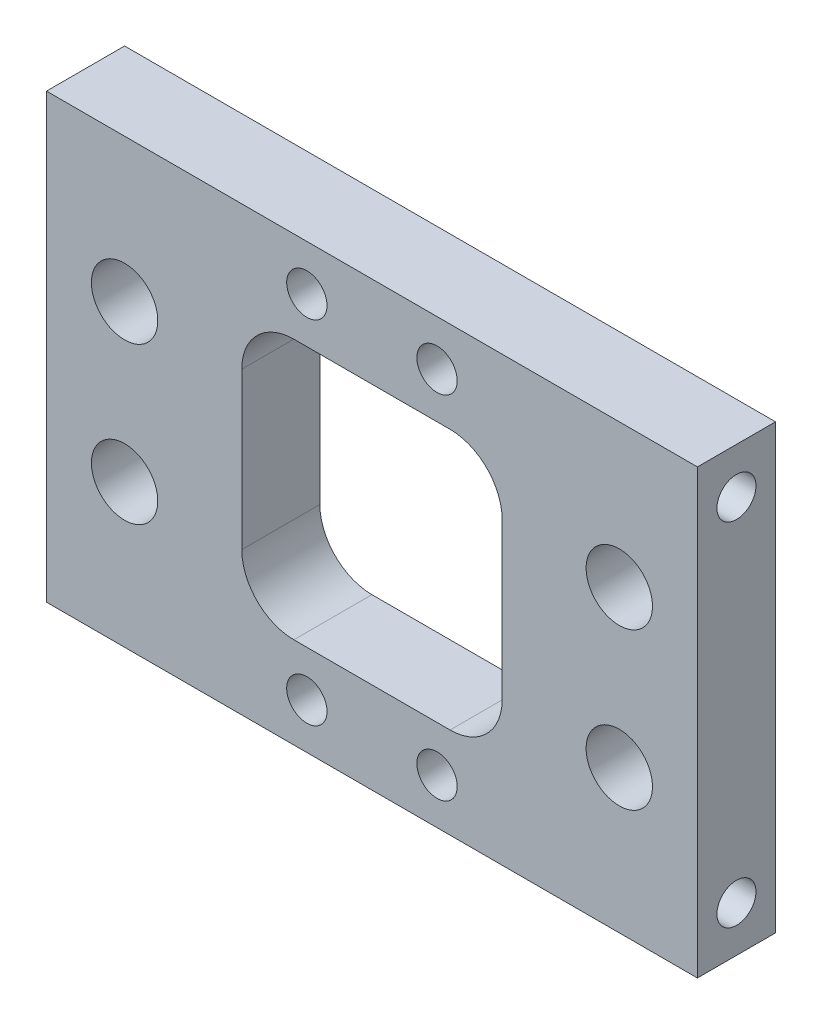
ISO-10303-21;
HEADER;
FILE_DESCRIPTION(('STEP AP214'),'2;1');
FILE_NAME('part.step','',(''),(''),'','','');
FILE_SCHEMA(('AUTOMOTIVE_DESIGN { 1 0 10303 214 1 1 1 1 }'));
ENDSEC;
DATA;
#1=APPLICATION_CONTEXT('core data for automotive mechanical design processes');
#2=APPLICATION_PROTOCOL_DEFINITION('international standard','automotive_design',2000,#1);
#3=PRODUCT_CONTEXT('',#1,'mechanical');
#4=PRODUCT('Part','Part','',(#3));
#5=PRODUCT_RELATED_PRODUCT_CATEGORY('part','',(#4));
#6=PRODUCT_DEFINITION_FORMATION('','',#4);
#7=PRODUCT_DEFINITION_CONTEXT('part definition',#1,'design');
#8=PRODUCT_DEFINITION('design','',#6,#7);
#9=PRODUCT_DEFINITION_SHAPE('','',#8);
#10=(LENGTH_UNIT() NAMED_UNIT(*) SI_UNIT(.MILLI.,.METRE.));
#11=(NAMED_UNIT(*) PLANE_ANGLE_UNIT() SI_UNIT($,.RADIAN.));
#12=(NAMED_UNIT(*) SI_UNIT($,.STERADIAN.) SOLID_ANGLE_UNIT());
#13=UNCERTAINTY_MEASURE_WITH_UNIT(LENGTH_MEASURE(1.E-05),#10,'distance_accuracy_value','');
#14=(GEOMETRIC_REPRESENTATION_CONTEXT(3) GLOBAL_UNCERTAINTY_ASSIGNED_CONTEXT((#13)) GLOBAL_UNIT_ASSIGNED_CONTEXT((#10,
#11,#12)) REPRESENTATION_CONTEXT('',''));
#15=CARTESIAN_POINT('',(0.,0.,0.));
#16=DIRECTION('',(0.,0.,1.));
#17=DIRECTION('',(1.,0.,0.));
#18=AXIS2_PLACEMENT_3D('',#15,#16,#17);
#19=CARTESIAN_POINT('',(25.,17.,3.));
#20=DIRECTION('',(1.,0.,0.));
#21=DIRECTION('',(0.,0.,-1.));
#22=AXIS2_PLACEMENT_3D('',#19,#20,#21);
#23=PLANE('',#22);
#24=CARTESIAN_POINT('',(25.,-13.5,0.));
#25=DIRECTION('',(1.,0.,0.));
#26=DIRECTION('',(0.,0.,-1.));
#27=AXIS2_PLACEMENT_3D('',#24,#25,#26);
#28=CIRCLE('',#27,1.49999999999999);
#29=CARTESIAN_POINT('',(25.,-13.5,-1.49999999999999));
#30=VERTEX_POINT('',#29);
#31=EDGE_CURVE('E278',#30,#30,#28,.T.);
#32=ORIENTED_EDGE('',*,*,#31,.F.);
#33=EDGE_LOOP('',(#32));
#34=FACE_BOUND('',#33,.T.);
#35=CARTESIAN_POINT('',(25.,13.5,0.));
#36=DIRECTION('',(1.,0.,0.));
#37=DIRECTION('',(0.,0.,-1.));
#38=AXIS2_PLACEMENT_3D('',#35,#36,#37);
#39=CIRCLE('',#38,1.49999999999999);
#40=CARTESIAN_POINT('',(25.,13.5,-1.49999999999999));
#41=VERTEX_POINT('',#40);
#42=EDGE_CURVE('E272',#41,#41,#39,.T.);
#43=ORIENTED_EDGE('',*,*,#42,.F.);
#44=EDGE_LOOP('',(#43));
#45=FACE_BOUND('',#44,.T.);
#46=DIRECTION('',(0.,-1.,0.));
#47=VECTOR('',#46,1.);
#48=CARTESIAN_POINT('',(25.,17.,-3.));
#49=LINE('',#48,#47);
#50=CARTESIAN_POINT('',(25.,17.,-3.));
#51=VERTEX_POINT('',#50);
#52=CARTESIAN_POINT('',(25.,-17.,-3.));
#53=VERTEX_POINT('',#52);
#54=EDGE_CURVE('E158',#51,#53,#49,.T.);
#55=ORIENTED_EDGE('',*,*,#54,.F.);
#56=DIRECTION('',(0.,0.,-1.));
#57=VECTOR('',#56,1.);
#58=CARTESIAN_POINT('',(25.,17.,3.));
#59=LINE('',#58,#57);
#60=CARTESIAN_POINT('',(25.,17.,3.));
#61=VERTEX_POINT('',#60);
#62=EDGE_CURVE('E146',#61,#51,#59,.T.);
#63=ORIENTED_EDGE('',*,*,#62,.F.);
#64=DIRECTION('',(0.,-1.,0.));
#65=VECTOR('',#64,1.);
#66=CARTESIAN_POINT('',(25.,17.,3.));
#67=LINE('',#66,#65);
#68=CARTESIAN_POINT('',(25.,-17.,3.));
#69=VERTEX_POINT('',#68);
#70=EDGE_CURVE('E141',#61,#69,#67,.T.);
#71=ORIENTED_EDGE('',*,*,#70,.T.);
#72=DIRECTION('',(0.,0.,-1.));
#73=VECTOR('',#72,1.);
#74=CARTESIAN_POINT('',(25.,-17.,3.));
#75=LINE('',#74,#73);
#76=EDGE_CURVE('E123',#69,#53,#75,.T.);
#77=ORIENTED_EDGE('',*,*,#76,.T.);
#78=EDGE_LOOP('',(#55,#63,#71,#77));
#79=FACE_BOUND('',#78,.T.);
#80=ADVANCED_FACE('F34',(#34,#45,#79),#23,.T.);
#81=CARTESIAN_POINT('',(-25.,17.,3.));
#82=DIRECTION('',(0.,1.,0.));
#83=DIRECTION('',(0.,0.,1.));
#84=AXIS2_PLACEMENT_3D('',#81,#82,#83);
#85=PLANE('',#84);
#86=DIRECTION('',(1.,0.,0.));
#87=VECTOR('',#86,1.);
#88=CARTESIAN_POINT('',(-25.,17.,-3.));
#89=LINE('',#88,#87);
#90=CARTESIAN_POINT('',(-25.,17.,-3.));
#91=VERTEX_POINT('',#90);
#92=EDGE_CURVE('E147',#91,#51,#89,.T.);
#93=ORIENTED_EDGE('',*,*,#92,.F.);
#94=DIRECTION('',(0.,0.,-1.));
#95=VECTOR('',#94,1.);
#96=CARTESIAN_POINT('',(-25.,17.,3.));
#97=LINE('',#96,#95);
#98=CARTESIAN_POINT('',(-25.,17.,3.));
#99=VERTEX_POINT('',#98);
#100=EDGE_CURVE('E166',#99,#91,#97,.T.);
#101=ORIENTED_EDGE('',*,*,#100,.F.);
#102=DIRECTION('',(1.,0.,0.));
#103=VECTOR('',#102,1.);
#104=CARTESIAN_POINT('',(-25.,17.,3.));
#105=LINE('',#104,#103);
#106=EDGE_CURVE('E134',#99,#61,#105,.T.);
#107=ORIENTED_EDGE('',*,*,#106,.T.);
#108=ORIENTED_EDGE('',*,*,#62,.T.);
#109=EDGE_LOOP('',(#93,#101,#107,#108));
#110=FACE_BOUND('',#109,.T.);
#111=ADVANCED_FACE('F320',(#110),#85,.T.);
#112=CARTESIAN_POINT('',(-25.,-17.,3.));
#113=DIRECTION('',(-1.,0.,0.));
#114=DIRECTION('',(0.,-1.,0.));
#115=AXIS2_PLACEMENT_3D('',#112,#113,#114);
#116=PLANE('',#115);
#117=CARTESIAN_POINT('',(-25.,-13.5,0.));
#118=DIRECTION('',(-1.,0.,0.));
#119=DIRECTION('',(0.,0.,1.));
#120=AXIS2_PLACEMENT_3D('',#117,#118,#119);
#121=CIRCLE('',#120,1.49999999999999);
#122=CARTESIAN_POINT('',(-25.,-13.5,1.49999999999999));
#123=VERTEX_POINT('',#122);
#124=EDGE_CURVE('E266',#123,#123,#121,.T.);
#125=ORIENTED_EDGE('',*,*,#124,.F.);
#126=EDGE_LOOP('',(#125));
#127=FACE_BOUND('',#126,.T.);
#128=CARTESIAN_POINT('',(-25.,13.5,0.));
#129=DIRECTION('',(-1.,0.,0.));
#130=DIRECTION('',(0.,0.,1.));
#131=AXIS2_PLACEMENT_3D('',#128,#129,#130);
#132=CIRCLE('',#131,1.49999999999999);
#133=CARTESIAN_POINT('',(-25.,13.5,1.49999999999999));
#134=VERTEX_POINT('',#133);
#135=EDGE_CURVE('E260',#134,#134,#132,.T.);
#136=ORIENTED_EDGE('',*,*,#135,.F.);
#137=EDGE_LOOP('',(#136));
#138=FACE_BOUND('',#137,.T.);
#139=DIRECTION('',(0.,1.,0.));
#140=VECTOR('',#139,1.);
#141=CARTESIAN_POINT('',(-25.,-17.,-3.));
#142=LINE('',#141,#140);
#143=CARTESIAN_POINT('',(-25.,-17.,-3.));
#144=VERTEX_POINT('',#143);
#145=EDGE_CURVE('E150',#144,#91,#142,.T.);
#146=ORIENTED_EDGE('',*,*,#145,.F.);
#147=DIRECTION('',(0.,0.,-1.));
#148=VECTOR('',#147,1.);
#149=CARTESIAN_POINT('',(-25.,-17.,3.));
#150=LINE('',#149,#148);
#151=CARTESIAN_POINT('',(-25.,-17.,3.));
#152=VERTEX_POINT('',#151);
#153=EDGE_CURVE('E133',#152,#144,#150,.T.);
#154=ORIENTED_EDGE('',*,*,#153,.F.);
#155=DIRECTION('',(0.,1.,0.));
#156=VECTOR('',#155,1.);
#157=CARTESIAN_POINT('',(-25.,-17.,3.));
#158=LINE('',#157,#156);
#159=EDGE_CURVE('E144',#152,#99,#158,.T.);
#160=ORIENTED_EDGE('',*,*,#159,.T.);
#161=ORIENTED_EDGE('',*,*,#100,.T.);
#162=EDGE_LOOP('',(#146,#154,#160,#161));
#163=FACE_BOUND('',#162,.T.);
#164=ADVANCED_FACE('F326',(#127,#138,#163),#116,.T.);
#165=CARTESIAN_POINT('',(25.,-17.,3.));
#166=DIRECTION('',(0.,-1.,0.));
#167=DIRECTION('',(0.,0.,-1.));
#168=AXIS2_PLACEMENT_3D('',#165,#166,#167);
#169=PLANE('',#168);
#170=DIRECTION('',(-1.,0.,0.));
#171=VECTOR('',#170,1.);
#172=CARTESIAN_POINT('',(25.,-17.,-3.));
#173=LINE('',#172,#171);
#174=EDGE_CURVE('E128',#53,#144,#173,.T.);
#175=ORIENTED_EDGE('',*,*,#174,.F.);
#176=ORIENTED_EDGE('',*,*,#76,.F.);
#177=DIRECTION('',(-1.,0.,0.));
#178=VECTOR('',#177,1.);
#179=CARTESIAN_POINT('',(25.,-17.,3.));
#180=LINE('',#179,#178);
#181=EDGE_CURVE('E126',#69,#152,#180,.T.);
#182=ORIENTED_EDGE('',*,*,#181,.T.);
#183=ORIENTED_EDGE('',*,*,#153,.T.);
#184=EDGE_LOOP('',(#175,#176,#182,#183));
#185=FACE_BOUND('',#184,.T.);
#186=ADVANCED_FACE('F125',(#185),#169,.T.);
#187=CARTESIAN_POINT('',(0.,0.,3.));
#188=DIRECTION('',(0.,0.,-1.));
#189=DIRECTION('',(-1.,0.,0.));
#190=AXIS2_PLACEMENT_3D('',#187,#188,#189);
#191=PLANE('',#190);
#192=CARTESIAN_POINT('',(5.,13.5,3.));
#193=DIRECTION('',(0.,0.,-1.));
#194=DIRECTION('',(1.,0.,0.));
#195=AXIS2_PLACEMENT_3D('',#192,#193,#194);
#196=CIRCLE('',#195,1.55);
#197=CARTESIAN_POINT('',(6.55,13.5,3.));
#198=VERTEX_POINT('',#197);
#199=EDGE_CURVE('E297',#198,#198,#196,.T.);
#200=ORIENTED_EDGE('',*,*,#199,.T.);
#201=EDGE_LOOP('',(#200));
#202=FACE_BOUND('',#201,.T.);
#203=CARTESIAN_POINT('',(-5.,13.5,3.));
#204=DIRECTION('',(0.,0.,-1.));
#205=DIRECTION('',(1.,0.,0.));
#206=AXIS2_PLACEMENT_3D('',#203,#204,#205);
#207=CIRCLE('',#206,1.55);
#208=CARTESIAN_POINT('',(-3.45,13.5,3.));
#209=VERTEX_POINT('',#208);
#210=EDGE_CURVE('E298',#209,#209,#207,.T.);
#211=ORIENTED_EDGE('',*,*,#210,.T.);
#212=EDGE_LOOP('',(#211));
#213=FACE_BOUND('',#212,.T.);
#214=CARTESIAN_POINT('',(5.,-13.5,3.));
#215=DIRECTION('',(0.,0.,1.));
#216=DIRECTION('',(1.,0.,0.));
#217=AXIS2_PLACEMENT_3D('',#214,#215,#216);
#218=CIRCLE('',#217,1.55);
#219=CARTESIAN_POINT('',(6.55,-13.5,3.));
#220=VERTEX_POINT('',#219);
#221=EDGE_CURVE('E281',#220,#220,#218,.T.);
#222=ORIENTED_EDGE('',*,*,#221,.F.);
#223=EDGE_LOOP('',(#222));
#224=FACE_BOUND('',#223,.T.);
#225=CARTESIAN_POINT('',(-5.,-13.5,3.));
#226=DIRECTION('',(0.,0.,1.));
#227=DIRECTION('',(1.,0.,0.));
#228=AXIS2_PLACEMENT_3D('',#225,#226,#227);
#229=CIRCLE('',#228,1.55);
#230=CARTESIAN_POINT('',(-3.45,-13.5,3.));
#231=VERTEX_POINT('',#230);
#232=EDGE_CURVE('E285',#231,#231,#229,.T.);
#233=ORIENTED_EDGE('',*,*,#232,.F.);
#234=EDGE_LOOP('',(#233));
#235=FACE_BOUND('',#234,.T.);
#236=CARTESIAN_POINT('',(19.,6.00000000000001,3.));
#237=DIRECTION('',(0.,0.,-1.));
#238=DIRECTION('',(-1.,0.,0.));
#239=AXIS2_PLACEMENT_3D('',#236,#237,#238);
#240=CIRCLE('',#239,2.55);
#241=CARTESIAN_POINT('',(16.45,6.00000000000001,3.));
#242=VERTEX_POINT('',#241);
#243=EDGE_CURVE('E251',#242,#242,#240,.T.);
#244=ORIENTED_EDGE('',*,*,#243,.T.);
#245=EDGE_LOOP('',(#244));
#246=FACE_BOUND('',#245,.T.);
#247=CARTESIAN_POINT('',(-19.,-6.00000000000001,3.));
#248=DIRECTION('',(0.,0.,-1.));
#249=DIRECTION('',(-1.,0.,0.));
#250=AXIS2_PLACEMENT_3D('',#247,#248,#249);
#251=CIRCLE('',#250,2.55);
#252=CARTESIAN_POINT('',(-21.55,-6.00000000000001,3.));
#253=VERTEX_POINT('',#252);
#254=EDGE_CURVE('E245',#253,#253,#251,.T.);
#255=ORIENTED_EDGE('',*,*,#254,.T.);
#256=EDGE_LOOP('',(#255));
#257=FACE_BOUND('',#256,.T.);
#258=CARTESIAN_POINT('',(19.,-6.00000000000001,3.));
#259=DIRECTION('',(0.,0.,-1.));
#260=DIRECTION('',(-1.,0.,0.));
#261=AXIS2_PLACEMENT_3D('',#258,#259,#260);
#262=CIRCLE('',#261,2.55);
#263=CARTESIAN_POINT('',(16.45,-6.00000000000001,3.));
#264=VERTEX_POINT('',#263);
#265=EDGE_CURVE('E239',#264,#264,#262,.T.);
#266=ORIENTED_EDGE('',*,*,#265,.T.);
#267=EDGE_LOOP('',(#266));
#268=FACE_BOUND('',#267,.T.);
#269=CARTESIAN_POINT('',(-19.,6.00000000000001,3.));
#270=DIRECTION('',(0.,0.,-1.));
#271=DIRECTION('',(-1.,0.,0.));
#272=AXIS2_PLACEMENT_3D('',#269,#270,#271);
#273=CIRCLE('',#272,2.55);
#274=CARTESIAN_POINT('',(-21.55,6.00000000000001,3.));
#275=VERTEX_POINT('',#274);
#276=EDGE_CURVE('E225',#275,#275,#273,.T.);
#277=ORIENTED_EDGE('',*,*,#276,.T.);
#278=EDGE_LOOP('',(#277));
#279=FACE_BOUND('',#278,.T.);
#280=DIRECTION('',(-1.,0.,0.));
#281=VECTOR('',#280,1.);
#282=CARTESIAN_POINT('',(10.,10.,3.));
#283=LINE('',#282,#281);
#284=CARTESIAN_POINT('',(6.00000000000001,10.,3.));
#285=VERTEX_POINT('',#284);
#286=CARTESIAN_POINT('',(-5.99999999999998,10.,3.));
#287=VERTEX_POINT('',#286);
#288=EDGE_CURVE('E202',#285,#287,#283,.T.);
#289=ORIENTED_EDGE('',*,*,#288,.F.);
#290=CARTESIAN_POINT('',(6.00000000000001,6.,3.));
#291=DIRECTION('',(0.,0.,-1.));
#292=DIRECTION('',(-1.,0.,0.));
#293=AXIS2_PLACEMENT_3D('',#290,#291,#292);
#294=CIRCLE('',#293,4.);
#295=CARTESIAN_POINT('',(10.,6.,3.));
#296=VERTEX_POINT('',#295);
#297=EDGE_CURVE('E191',#285,#296,#294,.T.);
#298=ORIENTED_EDGE('',*,*,#297,.T.);
#299=DIRECTION('',(0.,1.,0.));
#300=VECTOR('',#299,1.);
#301=CARTESIAN_POINT('',(10.,-10.,3.));
#302=LINE('',#301,#300);
#303=CARTESIAN_POINT('',(10.,-6.,3.));
#304=VERTEX_POINT('',#303);
#305=EDGE_CURVE('E211',#304,#296,#302,.T.);
#306=ORIENTED_EDGE('',*,*,#305,.F.);
#307=CARTESIAN_POINT('',(6.00000000000001,-6.,3.));
#308=DIRECTION('',(0.,0.,-1.));
#309=DIRECTION('',(-1.,0.,0.));
#310=AXIS2_PLACEMENT_3D('',#307,#308,#309);
#311=CIRCLE('',#310,4.);
#312=CARTESIAN_POINT('',(6.00000000000001,-10.,3.));
#313=VERTEX_POINT('',#312);
#314=EDGE_CURVE('E187',#304,#313,#311,.T.);
#315=ORIENTED_EDGE('',*,*,#314,.T.);
#316=DIRECTION('',(1.,0.,0.));
#317=VECTOR('',#316,1.);
#318=CARTESIAN_POINT('',(-9.99999999999999,-10.,3.));
#319=LINE('',#318,#317);
#320=CARTESIAN_POINT('',(-5.99999999999999,-10.,3.));
#321=VERTEX_POINT('',#320);
#322=EDGE_CURVE('E153',#321,#313,#319,.T.);
#323=ORIENTED_EDGE('',*,*,#322,.F.);
#324=CARTESIAN_POINT('',(-5.99999999999999,-6.,3.));
#325=DIRECTION('',(0.,0.,-1.));
#326=DIRECTION('',(-1.,0.,0.));
#327=AXIS2_PLACEMENT_3D('',#324,#325,#326);
#328=CIRCLE('',#327,4.);
#329=CARTESIAN_POINT('',(-9.99999999999999,-6.,3.));
#330=VERTEX_POINT('',#329);
#331=EDGE_CURVE('E195',#321,#330,#328,.T.);
#332=ORIENTED_EDGE('',*,*,#331,.T.);
#333=DIRECTION('',(0.,-1.,0.));
#334=VECTOR('',#333,1.);
#335=CARTESIAN_POINT('',(-9.99999999999999,10.,3.));
#336=LINE('',#335,#334);
#337=CARTESIAN_POINT('',(-9.99999999999999,6.,3.));
#338=VERTEX_POINT('',#337);
#339=EDGE_CURVE('E203',#338,#330,#336,.T.);
#340=ORIENTED_EDGE('',*,*,#339,.F.);
#341=CARTESIAN_POINT('',(-5.99999999999999,6.,3.));
#342=DIRECTION('',(0.,0.,-1.));
#343=DIRECTION('',(-1.,0.,0.));
#344=AXIS2_PLACEMENT_3D('',#341,#342,#343);
#345=CIRCLE('',#344,4.);
#346=EDGE_CURVE('E42',#338,#287,#345,.T.);
#347=ORIENTED_EDGE('',*,*,#346,.T.);
#348=EDGE_LOOP('',(#289,#298,#306,#315,#323,#332,#340,#347));
#349=FACE_BOUND('',#348,.T.);
#350=ORIENTED_EDGE('',*,*,#70,.F.);
#351=ORIENTED_EDGE('',*,*,#106,.F.);
#352=ORIENTED_EDGE('',*,*,#159,.F.);
#353=ORIENTED_EDGE('',*,*,#181,.F.);
#354=EDGE_LOOP('',(#350,#351,#352,#353));
#355=FACE_BOUND('',#354,.T.);
#356=ADVANCED_FACE('F139',(#202,#213,#224,#235,#246,#257,#268,#279,#349,#355),#191,.F.);
#357=CARTESIAN_POINT('',(0.,0.,-3.));
#358=DIRECTION('',(0.,0.,-1.));
#359=DIRECTION('',(-1.,0.,0.));
#360=AXIS2_PLACEMENT_3D('',#357,#358,#359);
#361=PLANE('',#360);
#362=CARTESIAN_POINT('',(5.,13.5,-3.));
#363=DIRECTION('',(0.,0.,-1.));
#364=DIRECTION('',(-1.,0.,0.));
#365=AXIS2_PLACEMENT_3D('',#362,#363,#364);
#366=CIRCLE('',#365,1.55);
#367=CARTESIAN_POINT('',(3.45,13.5,-3.));
#368=VERTEX_POINT('',#367);
#369=EDGE_CURVE('E286',#368,#368,#366,.T.);
#370=ORIENTED_EDGE('',*,*,#369,.F.);
#371=EDGE_LOOP('',(#370));
#372=FACE_BOUND('',#371,.T.);
#373=CARTESIAN_POINT('',(-5.,13.5,-3.));
#374=DIRECTION('',(0.,0.,-1.));
#375=DIRECTION('',(-1.,0.,0.));
#376=AXIS2_PLACEMENT_3D('',#373,#374,#375);
#377=CIRCLE('',#376,1.55);
#378=CARTESIAN_POINT('',(-6.55,13.5,-3.));
#379=VERTEX_POINT('',#378);
#380=EDGE_CURVE('E294',#379,#379,#377,.T.);
#381=ORIENTED_EDGE('',*,*,#380,.F.);
#382=EDGE_LOOP('',(#381));
#383=FACE_BOUND('',#382,.T.);
#384=CARTESIAN_POINT('',(5.,-13.5,-3.));
#385=DIRECTION('',(0.,0.,-1.));
#386=DIRECTION('',(-1.,0.,0.));
#387=AXIS2_PLACEMENT_3D('',#384,#385,#386);
#388=CIRCLE('',#387,1.55);
#389=CARTESIAN_POINT('',(3.45,-13.5,-3.));
#390=VERTEX_POINT('',#389);
#391=EDGE_CURVE('E289',#390,#390,#388,.F.);
#392=ORIENTED_EDGE('',*,*,#391,.T.);
#393=EDGE_LOOP('',(#392));
#394=FACE_BOUND('',#393,.T.);
#395=CARTESIAN_POINT('',(-5.,-13.5,-3.));
#396=DIRECTION('',(0.,0.,-1.));
#397=DIRECTION('',(-1.,0.,0.));
#398=AXIS2_PLACEMENT_3D('',#395,#396,#397);
#399=CIRCLE('',#398,1.55);
#400=CARTESIAN_POINT('',(-6.55,-13.5,-3.));
#401=VERTEX_POINT('',#400);
#402=EDGE_CURVE('E282',#401,#401,#399,.F.);
#403=ORIENTED_EDGE('',*,*,#402,.T.);
#404=EDGE_LOOP('',(#403));
#405=FACE_BOUND('',#404,.T.);
#406=CARTESIAN_POINT('',(19.,6.00000000000001,-3.));
#407=DIRECTION('',(0.,0.,-1.));
#408=DIRECTION('',(-1.,0.,0.));
#409=AXIS2_PLACEMENT_3D('',#406,#407,#408);
#410=CIRCLE('',#409,2.55);
#411=CARTESIAN_POINT('',(16.45,6.00000000000001,-3.));
#412=VERTEX_POINT('',#411);
#413=EDGE_CURVE('E254',#412,#412,#410,.T.);
#414=ORIENTED_EDGE('',*,*,#413,.F.);
#415=EDGE_LOOP('',(#414));
#416=FACE_BOUND('',#415,.T.);
#417=CARTESIAN_POINT('',(-19.,-6.00000000000001,-3.));
#418=DIRECTION('',(0.,0.,-1.));
#419=DIRECTION('',(-1.,0.,0.));
#420=AXIS2_PLACEMENT_3D('',#417,#418,#419);
#421=CIRCLE('',#420,2.55);
#422=CARTESIAN_POINT('',(-21.55,-6.00000000000001,-3.));
#423=VERTEX_POINT('',#422);
#424=EDGE_CURVE('E248',#423,#423,#421,.T.);
#425=ORIENTED_EDGE('',*,*,#424,.F.);
#426=EDGE_LOOP('',(#425));
#427=FACE_BOUND('',#426,.T.);
#428=CARTESIAN_POINT('',(19.,-6.00000000000001,-3.));
#429=DIRECTION('',(0.,0.,-1.));
#430=DIRECTION('',(-1.,0.,0.));
#431=AXIS2_PLACEMENT_3D('',#428,#429,#430);
#432=CIRCLE('',#431,2.55);
#433=CARTESIAN_POINT('',(16.45,-6.00000000000001,-3.));
#434=VERTEX_POINT('',#433);
#435=EDGE_CURVE('E242',#434,#434,#432,.T.);
#436=ORIENTED_EDGE('',*,*,#435,.F.);
#437=EDGE_LOOP('',(#436));
#438=FACE_BOUND('',#437,.T.);
#439=CARTESIAN_POINT('',(-19.,6.00000000000001,-3.));
#440=DIRECTION('',(0.,0.,-1.));
#441=DIRECTION('',(-1.,0.,0.));
#442=AXIS2_PLACEMENT_3D('',#439,#440,#441);
#443=CIRCLE('',#442,2.55);
#444=CARTESIAN_POINT('',(-21.55,6.00000000000001,-3.));
#445=VERTEX_POINT('',#444);
#446=EDGE_CURVE('E236',#445,#445,#443,.T.);
#447=ORIENTED_EDGE('',*,*,#446,.F.);
#448=EDGE_LOOP('',(#447));
#449=FACE_BOUND('',#448,.T.);
#450=DIRECTION('',(1.,0.,0.));
#451=VECTOR('',#450,1.);
#452=CARTESIAN_POINT('',(-9.99999999999999,-10.,-3.));
#453=LINE('',#452,#451);
#454=CARTESIAN_POINT('',(-5.99999999999999,-10.,-3.));
#455=VERTEX_POINT('',#454);
#456=CARTESIAN_POINT('',(6.00000000000001,-10.,-3.));
#457=VERTEX_POINT('',#456);
#458=EDGE_CURVE('E160',#455,#457,#453,.T.);
#459=ORIENTED_EDGE('',*,*,#458,.T.);
#460=CARTESIAN_POINT('',(6.00000000000001,-6.,-3.));
#461=DIRECTION('',(0.,0.,-1.));
#462=DIRECTION('',(-1.,0.,0.));
#463=AXIS2_PLACEMENT_3D('',#460,#461,#462);
#464=CIRCLE('',#463,4.);
#465=CARTESIAN_POINT('',(10.,-6.,-3.));
#466=VERTEX_POINT('',#465);
#467=EDGE_CURVE('E189',#457,#466,#464,.F.);
#468=ORIENTED_EDGE('',*,*,#467,.T.);
#469=DIRECTION('',(0.,1.,0.));
#470=VECTOR('',#469,1.);
#471=CARTESIAN_POINT('',(10.,-10.,-3.));
#472=LINE('',#471,#470);
#473=CARTESIAN_POINT('',(10.,6.,-3.));
#474=VERTEX_POINT('',#473);
#475=EDGE_CURVE('E220',#466,#474,#472,.T.);
#476=ORIENTED_EDGE('',*,*,#475,.T.);
#477=CARTESIAN_POINT('',(6.00000000000001,6.,-3.));
#478=DIRECTION('',(0.,0.,-1.));
#479=DIRECTION('',(-1.,0.,0.));
#480=AXIS2_PLACEMENT_3D('',#477,#478,#479);
#481=CIRCLE('',#480,4.);
#482=CARTESIAN_POINT('',(6.00000000000001,10.,-3.));
#483=VERTEX_POINT('',#482);
#484=EDGE_CURVE('E193',#474,#483,#481,.F.);
#485=ORIENTED_EDGE('',*,*,#484,.T.);
#486=DIRECTION('',(-1.,0.,0.));
#487=VECTOR('',#486,1.);
#488=CARTESIAN_POINT('',(10.,10.,-3.));
#489=LINE('',#488,#487);
#490=CARTESIAN_POINT('',(-5.99999999999998,10.,-3.));
#491=VERTEX_POINT('',#490);
#492=EDGE_CURVE('E216',#483,#491,#489,.T.);
#493=ORIENTED_EDGE('',*,*,#492,.T.);
#494=CARTESIAN_POINT('',(-5.99999999999999,6.,-3.));
#495=DIRECTION('',(0.,0.,-1.));
#496=DIRECTION('',(-1.,0.,0.));
#497=AXIS2_PLACEMENT_3D('',#494,#495,#496);
#498=CIRCLE('',#497,4.);
#499=CARTESIAN_POINT('',(-9.99999999999999,6.,-3.));
#500=VERTEX_POINT('',#499);
#501=EDGE_CURVE('E11',#491,#500,#498,.F.);
#502=ORIENTED_EDGE('',*,*,#501,.T.);
#503=DIRECTION('',(0.,-1.,0.));
#504=VECTOR('',#503,1.);
#505=CARTESIAN_POINT('',(-9.99999999999999,10.,-3.));
#506=LINE('',#505,#504);
#507=CARTESIAN_POINT('',(-9.99999999999999,-6.,-3.));
#508=VERTEX_POINT('',#507);
#509=EDGE_CURVE('E214',#500,#508,#506,.T.);
#510=ORIENTED_EDGE('',*,*,#509,.T.);
#511=CARTESIAN_POINT('',(-5.99999999999999,-6.,-3.));
#512=DIRECTION('',(0.,0.,-1.));
#513=DIRECTION('',(-1.,0.,0.));
#514=AXIS2_PLACEMENT_3D('',#511,#512,#513);
#515=CIRCLE('',#514,4.);
#516=EDGE_CURVE('E197',#508,#455,#515,.F.);
#517=ORIENTED_EDGE('',*,*,#516,.T.);
#518=EDGE_LOOP('',(#459,#468,#476,#485,#493,#502,#510,#517));
#519=FACE_BOUND('',#518,.T.);
#520=ORIENTED_EDGE('',*,*,#54,.T.);
#521=ORIENTED_EDGE('',*,*,#174,.T.);
#522=ORIENTED_EDGE('',*,*,#145,.T.);
#523=ORIENTED_EDGE('',*,*,#92,.T.);
#524=EDGE_LOOP('',(#520,#521,#522,#523));
#525=FACE_BOUND('',#524,.T.);
#526=ADVANCED_FACE('F351',(#372,#383,#394,#405,#416,#427,#438,#449,#519,#525),#361,.T.);
#527=CARTESIAN_POINT('',(10.,-10.,-3.));
#528=DIRECTION('',(1.,0.,0.));
#529=DIRECTION('',(0.,1.,0.));
#530=AXIS2_PLACEMENT_3D('',#527,#528,#529);
#531=PLANE('',#530);
#532=ORIENTED_EDGE('',*,*,#475,.F.);
#533=DIRECTION('',(0.,0.,1.));
#534=VECTOR('',#533,1.);
#535=CARTESIAN_POINT('',(10.,-6.,3.));
#536=LINE('',#535,#534);
#537=EDGE_CURVE('E170',#466,#304,#536,.T.);
#538=ORIENTED_EDGE('',*,*,#537,.T.);
#539=ORIENTED_EDGE('',*,*,#305,.T.);
#540=DIRECTION('',(0.,0.,1.));
#541=VECTOR('',#540,1.);
#542=CARTESIAN_POINT('',(10.,6.,-3.));
#543=LINE('',#542,#541);
#544=EDGE_CURVE('E165',#296,#474,#543,.F.);
#545=ORIENTED_EDGE('',*,*,#544,.T.);
#546=EDGE_LOOP('',(#532,#538,#539,#545));
#547=FACE_BOUND('',#546,.T.);
#548=ADVANCED_FACE('F357',(#547),#531,.F.);
#549=CARTESIAN_POINT('',(-9.99999999999999,-10.,-3.));
#550=DIRECTION('',(0.,-1.,0.));
#551=DIRECTION('',(0.,0.,-1.));
#552=AXIS2_PLACEMENT_3D('',#549,#550,#551);
#553=PLANE('',#552);
#554=ORIENTED_EDGE('',*,*,#322,.T.);
#555=DIRECTION('',(0.,0.,1.));
#556=VECTOR('',#555,1.);
#557=CARTESIAN_POINT('',(6.00000000000001,-10.,-3.));
#558=LINE('',#557,#556);
#559=EDGE_CURVE('E176',#313,#457,#558,.F.);
#560=ORIENTED_EDGE('',*,*,#559,.T.);
#561=ORIENTED_EDGE('',*,*,#458,.F.);
#562=DIRECTION('',(0.,0.,1.));
#563=VECTOR('',#562,1.);
#564=CARTESIAN_POINT('',(-5.99999999999999,-10.,3.));
#565=LINE('',#564,#563);
#566=EDGE_CURVE('E173',#455,#321,#565,.T.);
#567=ORIENTED_EDGE('',*,*,#566,.T.);
#568=EDGE_LOOP('',(#554,#560,#561,#567));
#569=FACE_BOUND('',#568,.T.);
#570=ADVANCED_FACE('F354',(#569),#553,.F.);
#571=CARTESIAN_POINT('',(-9.99999999999999,10.,-3.));
#572=DIRECTION('',(-1.,0.,0.));
#573=DIRECTION('',(0.,-1.,0.));
#574=AXIS2_PLACEMENT_3D('',#571,#572,#573);
#575=PLANE('',#574);
#576=ORIENTED_EDGE('',*,*,#339,.T.);
#577=DIRECTION('',(0.,0.,1.));
#578=VECTOR('',#577,1.);
#579=CARTESIAN_POINT('',(-9.99999999999999,-6.,-3.));
#580=LINE('',#579,#578);
#581=EDGE_CURVE('E49',#330,#508,#580,.F.);
#582=ORIENTED_EDGE('',*,*,#581,.T.);
#583=ORIENTED_EDGE('',*,*,#509,.F.);
#584=DIRECTION('',(0.,0.,1.));
#585=VECTOR('',#584,1.);
#586=CARTESIAN_POINT('',(-9.99999999999999,6.,3.));
#587=LINE('',#586,#585);
#588=EDGE_CURVE('E183',#500,#338,#587,.T.);
#589=ORIENTED_EDGE('',*,*,#588,.T.);
#590=EDGE_LOOP('',(#576,#582,#583,#589));
#591=FACE_BOUND('',#590,.T.);
#592=ADVANCED_FACE('F213',(#591),#575,.F.);
#593=CARTESIAN_POINT('',(10.,10.,-3.));
#594=DIRECTION('',(0.,1.,0.));
#595=DIRECTION('',(0.,0.,1.));
#596=AXIS2_PLACEMENT_3D('',#593,#594,#595);
#597=PLANE('',#596);
#598=ORIENTED_EDGE('',*,*,#492,.F.);
#599=DIRECTION('',(0.,0.,1.));
#600=VECTOR('',#599,1.);
#601=CARTESIAN_POINT('',(6.00000000000001,10.,3.));
#602=LINE('',#601,#600);
#603=EDGE_CURVE('E180',#483,#285,#602,.T.);
#604=ORIENTED_EDGE('',*,*,#603,.T.);
#605=ORIENTED_EDGE('',*,*,#288,.T.);
#606=DIRECTION('',(0.,0.,1.));
#607=VECTOR('',#606,1.);
#608=CARTESIAN_POINT('',(-5.99999999999999,10.,-3.));
#609=LINE('',#608,#607);
#610=EDGE_CURVE('E178',#287,#491,#609,.F.);
#611=ORIENTED_EDGE('',*,*,#610,.T.);
#612=EDGE_LOOP('',(#598,#604,#605,#611));
#613=FACE_BOUND('',#612,.T.);
#614=ADVANCED_FACE('F209',(#613),#597,.F.);
#615=CARTESIAN_POINT('',(-19.,6.00000000000001,-3.));
#616=DIRECTION('',(0.,0.,-1.));
#617=DIRECTION('',(-1.,0.,0.));
#618=AXIS2_PLACEMENT_3D('',#615,#616,#617);
#619=CYLINDRICAL_SURFACE('',#618,2.55);
#620=ORIENTED_EDGE('',*,*,#276,.F.);
#621=EDGE_LOOP('',(#620));
#622=FACE_BOUND('',#621,.T.);
#623=ORIENTED_EDGE('',*,*,#446,.T.);
#624=EDGE_LOOP('',(#623));
#625=FACE_BOUND('',#624,.T.);
#626=ADVANCED_FACE('F414',(#622,#625),#619,.F.);
#627=CARTESIAN_POINT('',(19.,-6.00000000000001,-3.));
#628=DIRECTION('',(0.,0.,-1.));
#629=DIRECTION('',(-1.,0.,0.));
#630=AXIS2_PLACEMENT_3D('',#627,#628,#629);
#631=CYLINDRICAL_SURFACE('',#630,2.55);
#632=ORIENTED_EDGE('',*,*,#265,.F.);
#633=EDGE_LOOP('',(#632));
#634=FACE_BOUND('',#633,.T.);
#635=ORIENTED_EDGE('',*,*,#435,.T.);
#636=EDGE_LOOP('',(#635));
#637=FACE_BOUND('',#636,.T.);
#638=ADVANCED_FACE('F410',(#634,#637),#631,.F.);
#639=CARTESIAN_POINT('',(-19.,-6.00000000000001,-3.));
#640=DIRECTION('',(0.,0.,-1.));
#641=DIRECTION('',(-1.,0.,0.));
#642=AXIS2_PLACEMENT_3D('',#639,#640,#641);
#643=CYLINDRICAL_SURFACE('',#642,2.55);
#644=ORIENTED_EDGE('',*,*,#254,.F.);
#645=EDGE_LOOP('',(#644));
#646=FACE_BOUND('',#645,.T.);
#647=ORIENTED_EDGE('',*,*,#424,.T.);
#648=EDGE_LOOP('',(#647));
#649=FACE_BOUND('',#648,.T.);
#650=ADVANCED_FACE('F406',(#646,#649),#643,.F.);
#651=CARTESIAN_POINT('',(19.,6.00000000000001,-3.));
#652=DIRECTION('',(0.,0.,-1.));
#653=DIRECTION('',(-1.,0.,0.));
#654=AXIS2_PLACEMENT_3D('',#651,#652,#653);
#655=CYLINDRICAL_SURFACE('',#654,2.55);
#656=ORIENTED_EDGE('',*,*,#243,.F.);
#657=EDGE_LOOP('',(#656));
#658=FACE_BOUND('',#657,.T.);
#659=ORIENTED_EDGE('',*,*,#413,.T.);
#660=EDGE_LOOP('',(#659));
#661=FACE_BOUND('',#660,.T.);
#662=ADVANCED_FACE('F398',(#658,#661),#655,.F.);
#663=CARTESIAN_POINT('',(-20.,13.5,0.));
#664=DIRECTION('',(1.,0.,0.));
#665=DIRECTION('',(0.,0.,-1.));
#666=AXIS2_PLACEMENT_3D('',#663,#664,#665);
#667=PLANE('',#666);
#668=CARTESIAN_POINT('',(-20.,13.5,0.));
#669=DIRECTION('',(-1.,0.,0.));
#670=DIRECTION('',(0.,0.,1.));
#671=AXIS2_PLACEMENT_3D('',#668,#669,#670);
#672=CIRCLE('',#671,1.49999999999999);
#673=CARTESIAN_POINT('',(-20.,13.5,1.49999999999999));
#674=VERTEX_POINT('',#673);
#675=EDGE_CURVE('E257',#674,#674,#672,.T.);
#676=ORIENTED_EDGE('',*,*,#675,.T.);
#677=EDGE_LOOP('',(#676));
#678=FACE_BOUND('',#677,.T.);
#679=ADVANCED_FACE('F388',(#678),#667,.F.);
#680=CARTESIAN_POINT('',(-25.,13.5,0.));
#681=DIRECTION('',(-1.,0.,0.));
#682=DIRECTION('',(0.,0.,1.));
#683=AXIS2_PLACEMENT_3D('',#680,#681,#682);
#684=CYLINDRICAL_SURFACE('',#683,1.49999999999999);
#685=ORIENTED_EDGE('',*,*,#675,.F.);
#686=EDGE_LOOP('',(#685));
#687=FACE_BOUND('',#686,.T.);
#688=ORIENTED_EDGE('',*,*,#135,.T.);
#689=EDGE_LOOP('',(#688));
#690=FACE_BOUND('',#689,.T.);
#691=ADVANCED_FACE('F385',(#687,#690),#684,.F.);
#692=CARTESIAN_POINT('',(-20.,-13.5,0.));
#693=DIRECTION('',(1.,0.,0.));
#694=DIRECTION('',(0.,0.,-1.));
#695=AXIS2_PLACEMENT_3D('',#692,#693,#694);
#696=PLANE('',#695);
#697=CARTESIAN_POINT('',(-20.,-13.5,0.));
#698=DIRECTION('',(-1.,0.,0.));
#699=DIRECTION('',(0.,0.,1.));
#700=AXIS2_PLACEMENT_3D('',#697,#698,#699);
#701=CIRCLE('',#700,1.49999999999999);
#702=CARTESIAN_POINT('',(-20.,-13.5,1.49999999999999));
#703=VERTEX_POINT('',#702);
#704=EDGE_CURVE('E263',#703,#703,#701,.T.);
#705=ORIENTED_EDGE('',*,*,#704,.T.);
#706=EDGE_LOOP('',(#705));
#707=FACE_BOUND('',#706,.T.);
#708=ADVANCED_FACE('F387',(#707),#696,.F.);
#709=CARTESIAN_POINT('',(-25.,-13.5,0.));
#710=DIRECTION('',(-1.,0.,0.));
#711=DIRECTION('',(0.,0.,1.));
#712=AXIS2_PLACEMENT_3D('',#709,#710,#711);
#713=CYLINDRICAL_SURFACE('',#712,1.49999999999999);
#714=ORIENTED_EDGE('',*,*,#704,.F.);
#715=EDGE_LOOP('',(#714));
#716=FACE_BOUND('',#715,.T.);
#717=ORIENTED_EDGE('',*,*,#124,.T.);
#718=EDGE_LOOP('',(#717));
#719=FACE_BOUND('',#718,.T.);
#720=ADVANCED_FACE('F395',(#716,#719),#713,.F.);
#721=CARTESIAN_POINT('',(20.,13.5,0.));
#722=DIRECTION('',(-1.,0.,0.));
#723=DIRECTION('',(0.,0.,1.));
#724=AXIS2_PLACEMENT_3D('',#721,#722,#723);
#725=PLANE('',#724);
#726=CARTESIAN_POINT('',(20.,13.5,0.));
#727=DIRECTION('',(1.,0.,0.));
#728=DIRECTION('',(0.,0.,-1.));
#729=AXIS2_PLACEMENT_3D('',#726,#727,#728);
#730=CIRCLE('',#729,1.49999999999999);
#731=CARTESIAN_POINT('',(20.,13.5,-1.49999999999999));
#732=VERTEX_POINT('',#731);
#733=EDGE_CURVE('E269',#732,#732,#730,.T.);
#734=ORIENTED_EDGE('',*,*,#733,.T.);
#735=EDGE_LOOP('',(#734));
#736=FACE_BOUND('',#735,.T.);
#737=ADVANCED_FACE('F466',(#736),#725,.F.);
#738=CARTESIAN_POINT('',(25.,13.5,0.));
#739=DIRECTION('',(1.,0.,0.));
#740=DIRECTION('',(0.,0.,-1.));
#741=AXIS2_PLACEMENT_3D('',#738,#739,#740);
#742=CYLINDRICAL_SURFACE('',#741,1.49999999999999);
#743=ORIENTED_EDGE('',*,*,#733,.F.);
#744=EDGE_LOOP('',(#743));
#745=FACE_BOUND('',#744,.T.);
#746=ORIENTED_EDGE('',*,*,#42,.T.);
#747=EDGE_LOOP('',(#746));
#748=FACE_BOUND('',#747,.T.);
#749=ADVANCED_FACE('F481',(#745,#748),#742,.F.);
#750=CARTESIAN_POINT('',(20.,-13.5,0.));
#751=DIRECTION('',(-1.,0.,0.));
#752=DIRECTION('',(0.,0.,1.));
#753=AXIS2_PLACEMENT_3D('',#750,#751,#752);
#754=PLANE('',#753);
#755=CARTESIAN_POINT('',(20.,-13.5,0.));
#756=DIRECTION('',(1.,0.,0.));
#757=DIRECTION('',(0.,0.,-1.));
#758=AXIS2_PLACEMENT_3D('',#755,#756,#757);
#759=CIRCLE('',#758,1.49999999999999);
#760=CARTESIAN_POINT('',(20.,-13.5,-1.49999999999999));
#761=VERTEX_POINT('',#760);
#762=EDGE_CURVE('E275',#761,#761,#759,.T.);
#763=ORIENTED_EDGE('',*,*,#762,.T.);
#764=EDGE_LOOP('',(#763));
#765=FACE_BOUND('',#764,.T.);
#766=ADVANCED_FACE('F491',(#765),#754,.F.);
#767=CARTESIAN_POINT('',(25.,-13.5,0.));
#768=DIRECTION('',(1.,0.,0.));
#769=DIRECTION('',(0.,0.,-1.));
#770=AXIS2_PLACEMENT_3D('',#767,#768,#769);
#771=CYLINDRICAL_SURFACE('',#770,1.49999999999999);
#772=ORIENTED_EDGE('',*,*,#762,.F.);
#773=EDGE_LOOP('',(#772));
#774=FACE_BOUND('',#773,.T.);
#775=ORIENTED_EDGE('',*,*,#31,.T.);
#776=EDGE_LOOP('',(#775));
#777=FACE_BOUND('',#776,.T.);
#778=ADVANCED_FACE('F338',(#774,#777),#771,.F.);
#779=CARTESIAN_POINT('',(6.00000000000001,-6.,-3.));
#780=DIRECTION('',(0.,0.,-1.));
#781=DIRECTION('',(-1.,0.,0.));
#782=AXIS2_PLACEMENT_3D('',#779,#780,#781);
#783=CYLINDRICAL_SURFACE('',#782,4.);
#784=ORIENTED_EDGE('',*,*,#467,.F.);
#785=ORIENTED_EDGE('',*,*,#559,.F.);
#786=ORIENTED_EDGE('',*,*,#314,.F.);
#787=ORIENTED_EDGE('',*,*,#537,.F.);
#788=EDGE_LOOP('',(#784,#785,#786,#787));
#789=FACE_BOUND('',#788,.T.);
#790=ADVANCED_FACE('F334',(#789),#783,.F.);
#791=CARTESIAN_POINT('',(6.00000000000001,6.,-3.));
#792=DIRECTION('',(0.,0.,-1.));
#793=DIRECTION('',(-1.,0.,0.));
#794=AXIS2_PLACEMENT_3D('',#791,#792,#793);
#795=CYLINDRICAL_SURFACE('',#794,4.);
#796=ORIENTED_EDGE('',*,*,#484,.F.);
#797=ORIENTED_EDGE('',*,*,#544,.F.);
#798=ORIENTED_EDGE('',*,*,#297,.F.);
#799=ORIENTED_EDGE('',*,*,#603,.F.);
#800=EDGE_LOOP('',(#796,#797,#798,#799));
#801=FACE_BOUND('',#800,.T.);
#802=ADVANCED_FACE('F337',(#801),#795,.F.);
#803=CARTESIAN_POINT('',(-5.99999999999999,-6.,-3.));
#804=DIRECTION('',(0.,0.,-1.));
#805=DIRECTION('',(-1.,0.,0.));
#806=AXIS2_PLACEMENT_3D('',#803,#804,#805);
#807=CYLINDRICAL_SURFACE('',#806,4.);
#808=ORIENTED_EDGE('',*,*,#516,.F.);
#809=ORIENTED_EDGE('',*,*,#581,.F.);
#810=ORIENTED_EDGE('',*,*,#331,.F.);
#811=ORIENTED_EDGE('',*,*,#566,.F.);
#812=EDGE_LOOP('',(#808,#809,#810,#811));
#813=FACE_BOUND('',#812,.T.);
#814=ADVANCED_FACE('F341',(#813),#807,.F.);
#815=CARTESIAN_POINT('',(-5.99999999999999,6.,-3.));
#816=DIRECTION('',(0.,0.,-1.));
#817=DIRECTION('',(-1.,0.,0.));
#818=AXIS2_PLACEMENT_3D('',#815,#816,#817);
#819=CYLINDRICAL_SURFACE('',#818,4.);
#820=ORIENTED_EDGE('',*,*,#501,.F.);
#821=ORIENTED_EDGE('',*,*,#610,.F.);
#822=ORIENTED_EDGE('',*,*,#346,.F.);
#823=ORIENTED_EDGE('',*,*,#588,.F.);
#824=EDGE_LOOP('',(#820,#821,#822,#823));
#825=FACE_BOUND('',#824,.T.);
#826=ADVANCED_FACE('F36',(#825),#819,.F.);
#827=CARTESIAN_POINT('',(-5.,-13.5,-3.001));
#828=DIRECTION('',(0.,0.,1.));
#829=DIRECTION('',(1.,0.,0.));
#830=AXIS2_PLACEMENT_3D('',#827,#828,#829);
#831=CYLINDRICAL_SURFACE('',#830,1.55);
#832=ORIENTED_EDGE('',*,*,#402,.F.);
#833=EDGE_LOOP('',(#832));
#834=FACE_BOUND('',#833,.T.);
#835=ORIENTED_EDGE('',*,*,#232,.T.);
#836=EDGE_LOOP('',(#835));
#837=FACE_BOUND('',#836,.T.);
#838=ADVANCED_FACE('F348',(#834,#837),#831,.F.);
#839=CARTESIAN_POINT('',(5.,-13.5,-3.001));
#840=DIRECTION('',(0.,0.,1.));
#841=DIRECTION('',(1.,0.,0.));
#842=AXIS2_PLACEMENT_3D('',#839,#840,#841);
#843=CYLINDRICAL_SURFACE('',#842,1.55);
#844=ORIENTED_EDGE('',*,*,#391,.F.);
#845=EDGE_LOOP('',(#844));
#846=FACE_BOUND('',#845,.T.);
#847=ORIENTED_EDGE('',*,*,#221,.T.);
#848=EDGE_LOOP('',(#847));
#849=FACE_BOUND('',#848,.T.);
#850=ADVANCED_FACE('F316',(#846,#849),#843,.F.);
#851=CARTESIAN_POINT('',(-5.,13.5,-3.001));
#852=DIRECTION('',(0.,0.,1.));
#853=DIRECTION('',(1.,0.,0.));
#854=AXIS2_PLACEMENT_3D('',#851,#852,#853);
#855=CYLINDRICAL_SURFACE('',#854,1.55);
#856=ORIENTED_EDGE('',*,*,#380,.T.);
#857=EDGE_LOOP('',(#856));
#858=FACE_BOUND('',#857,.T.);
#859=ORIENTED_EDGE('',*,*,#210,.F.);
#860=EDGE_LOOP('',(#859));
#861=FACE_BOUND('',#860,.T.);
#862=ADVANCED_FACE('F310',(#858,#861),#855,.F.);
#863=CARTESIAN_POINT('',(5.,13.5,-3.001));
#864=DIRECTION('',(0.,0.,1.));
#865=DIRECTION('',(1.,0.,0.));
#866=AXIS2_PLACEMENT_3D('',#863,#864,#865);
#867=CYLINDRICAL_SURFACE('',#866,1.55);
#868=ORIENTED_EDGE('',*,*,#369,.T.);
#869=EDGE_LOOP('',(#868));
#870=FACE_BOUND('',#869,.T.);
#871=ORIENTED_EDGE('',*,*,#199,.F.);
#872=EDGE_LOOP('',(#871));
#873=FACE_BOUND('',#872,.T.);
#874=ADVANCED_FACE('F308',(#870,#873),#867,.F.);
#875=CLOSED_SHELL('',(#80,#111,#164,#186,#356,#526,#548,#570,#592,#614,#626,#638,#650,#662,#679,
#691,#708,#720,#737,#749,#766,#778,#790,#802,#814,#826,#838,#850,#862,#874));
#876=MANIFOLD_SOLID_BREP('B2',#875);
#877=ADVANCED_BREP_SHAPE_REPRESENTATION('',(#18,#876),#14);
#878=SHAPE_DEFINITION_REPRESENTATION(#9,#877);
ENDSEC;
END-ISO-10303-21;
